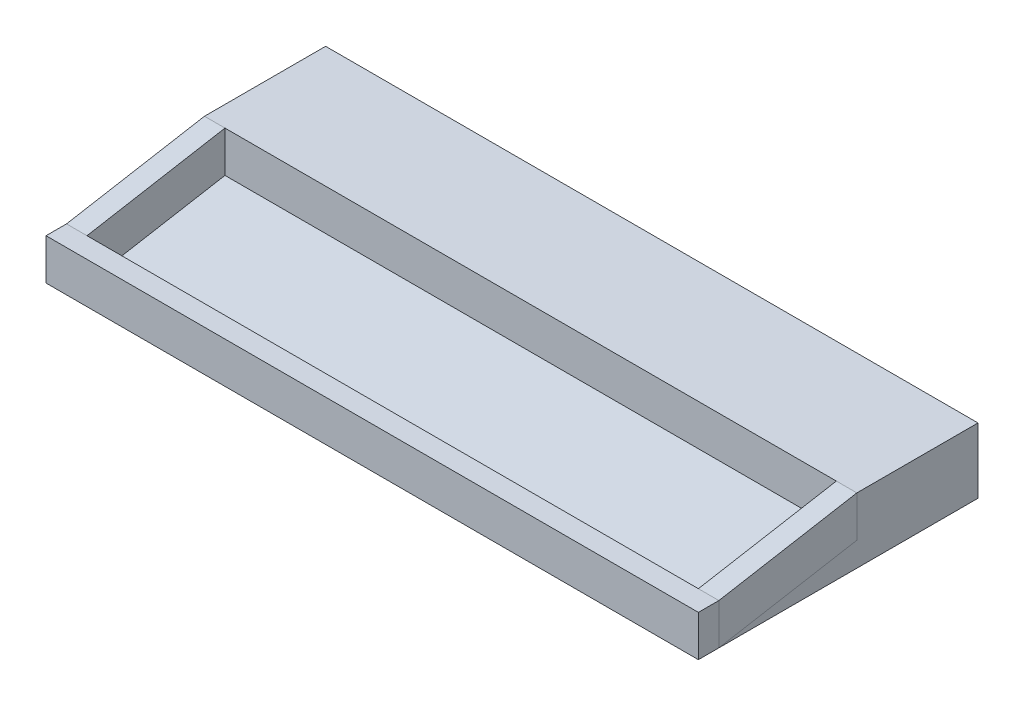
ISO-10303-21;
HEADER;
FILE_DESCRIPTION(('STEP AP214'),'2;1');
FILE_NAME('part.step','',(''),(''),'','','');
FILE_SCHEMA(('AUTOMOTIVE_DESIGN { 1 0 10303 214 1 1 1 1 }'));
ENDSEC;
DATA;
#1=APPLICATION_CONTEXT('core data for automotive mechanical design processes');
#2=APPLICATION_PROTOCOL_DEFINITION('international standard','automotive_design',2000,#1);
#3=PRODUCT_CONTEXT('',#1,'mechanical');
#4=PRODUCT('Part','Part','',(#3));
#5=PRODUCT_RELATED_PRODUCT_CATEGORY('part','',(#4));
#6=PRODUCT_DEFINITION_FORMATION('','',#4);
#7=PRODUCT_DEFINITION_CONTEXT('part definition',#1,'design');
#8=PRODUCT_DEFINITION('design','',#6,#7);
#9=PRODUCT_DEFINITION_SHAPE('','',#8);
#10=(LENGTH_UNIT() NAMED_UNIT(*) SI_UNIT(.MILLI.,.METRE.));
#11=(NAMED_UNIT(*) PLANE_ANGLE_UNIT() SI_UNIT($,.RADIAN.));
#12=(NAMED_UNIT(*) SI_UNIT($,.STERADIAN.) SOLID_ANGLE_UNIT());
#13=UNCERTAINTY_MEASURE_WITH_UNIT(LENGTH_MEASURE(1.E-05),#10,'distance_accuracy_value','');
#14=(GEOMETRIC_REPRESENTATION_CONTEXT(3) GLOBAL_UNCERTAINTY_ASSIGNED_CONTEXT((#13)) GLOBAL_UNIT_ASSIGNED_CONTEXT((#10,
#11,#12)) REPRESENTATION_CONTEXT('',''));
#15=CARTESIAN_POINT('',(0.,0.,0.));
#16=DIRECTION('',(0.,0.,1.));
#17=DIRECTION('',(1.,0.,0.));
#18=AXIS2_PLACEMENT_3D('',#15,#16,#17);
#19=CARTESIAN_POINT('',(22.,-18.5466378588945,57.9784896892125));
#20=DIRECTION('',(0.,0.,-1.));
#21=DIRECTION('',(-1.,0.,0.));
#22=AXIS2_PLACEMENT_3D('',#19,#20,#21);
#23=PLANE('',#22);
#24=DIRECTION('',(0.,-1.,0.));
#25=VECTOR('',#24,1.);
#26=CARTESIAN_POINT('',(0.,-18.5466378588945,57.9784896892125));
#27=LINE('',#26,#25);
#28=CARTESIAN_POINT('',(0.,25.4533621411055,57.9784896892125));
#29=VERTEX_POINT('',#28);
#30=CARTESIAN_POINT('',(0.,-18.5466378588945,57.9784896892125));
#31=VERTEX_POINT('',#30);
#32=EDGE_CURVE('E111',#29,#31,#27,.T.);
#33=ORIENTED_EDGE('',*,*,#32,.F.);
#34=DIRECTION('',(-1.,0.,0.));
#35=VECTOR('',#34,1.);
#36=CARTESIAN_POINT('',(22.,25.4533621411055,57.9784896892125));
#37=LINE('',#36,#35);
#38=CARTESIAN_POINT('',(22.,25.4533621411055,57.9784896892125));
#39=VERTEX_POINT('',#38);
#40=EDGE_CURVE('E12',#39,#29,#37,.T.);
#41=ORIENTED_EDGE('',*,*,#40,.F.);
#42=DIRECTION('',(0.,-1.,0.));
#43=VECTOR('',#42,1.);
#44=CARTESIAN_POINT('',(22.,-18.5466378588945,57.9784896892125));
#45=LINE('',#44,#43);
#46=CARTESIAN_POINT('',(22.,-18.5466378588945,57.9784896892125));
#47=VERTEX_POINT('',#46);
#48=EDGE_CURVE('E105',#39,#47,#45,.T.);
#49=ORIENTED_EDGE('',*,*,#48,.T.);
#50=DIRECTION('',(-1.,0.,0.));
#51=VECTOR('',#50,1.);
#52=CARTESIAN_POINT('',(22.,-18.5466378588945,57.9784896892125));
#53=LINE('',#52,#51);
#54=EDGE_CURVE('E50',#47,#31,#53,.T.);
#55=ORIENTED_EDGE('',*,*,#54,.T.);
#56=EDGE_LOOP('',(#33,#41,#49,#55));
#57=FACE_BOUND('',#56,.T.);
#58=ADVANCED_FACE('F47',(#57),#23,.T.);
#59=CARTESIAN_POINT('',(22.,25.4533621411055,57.9784896892125));
#60=DIRECTION('',(0.,0.984924044664879,0.172987358616101));
#61=DIRECTION('',(0.,-0.172987358616101,0.984924044664879));
#62=AXIS2_PLACEMENT_3D('',#59,#60,#61);
#63=PLANE('',#62);
#64=DIRECTION('',(0.,0.172987358616101,-0.984924044664879));
#65=VECTOR('',#64,1.);
#66=CARTESIAN_POINT('',(0.,25.4533621411055,57.9784896892125));
#67=LINE('',#66,#65);
#68=CARTESIAN_POINT('',(0.,-0.546637858894552,206.012573602344));
#69=VERTEX_POINT('',#68);
#70=EDGE_CURVE('E107',#69,#29,#67,.T.);
#71=ORIENTED_EDGE('',*,*,#70,.F.);
#72=DIRECTION('',(-1.,0.,0.));
#73=VECTOR('',#72,1.);
#74=CARTESIAN_POINT('',(22.,-0.546637858894552,206.012573602344));
#75=LINE('',#74,#73);
#76=CARTESIAN_POINT('',(22.,-0.546637858894552,206.012573602344));
#77=VERTEX_POINT('',#76);
#78=EDGE_CURVE('E56',#77,#69,#75,.T.);
#79=ORIENTED_EDGE('',*,*,#78,.F.);
#80=DIRECTION('',(0.,0.172987358616101,-0.984924044664879));
#81=VECTOR('',#80,1.);
#82=CARTESIAN_POINT('',(22.,25.4533621411055,57.9784896892125));
#83=LINE('',#82,#81);
#84=EDGE_CURVE('E102',#77,#39,#83,.T.);
#85=ORIENTED_EDGE('',*,*,#84,.T.);
#86=ORIENTED_EDGE('',*,*,#40,.T.);
#87=EDGE_LOOP('',(#71,#79,#85,#86));
#88=FACE_BOUND('',#87,.T.);
#89=ADVANCED_FACE('F121',(#88),#63,.T.);
#90=CARTESIAN_POINT('',(22.,-0.546637858894552,206.012573602344));
#91=DIRECTION('',(0.,0.,1.));
#92=DIRECTION('',(0.,-1.,0.));
#93=AXIS2_PLACEMENT_3D('',#90,#91,#92);
#94=PLANE('',#93);
#95=DIRECTION('',(0.,1.,0.));
#96=VECTOR('',#95,1.);
#97=CARTESIAN_POINT('',(0.,-0.546637858894552,206.012573602344));
#98=LINE('',#97,#96);
#99=CARTESIAN_POINT('',(0.,-44.5466378588946,206.012573602344));
#100=VERTEX_POINT('',#99);
#101=EDGE_CURVE('E97',#100,#69,#98,.T.);
#102=ORIENTED_EDGE('',*,*,#101,.F.);
#103=DIRECTION('',(-1.,0.,0.));
#104=VECTOR('',#103,1.);
#105=CARTESIAN_POINT('',(22.,-44.5466378588946,206.012573602344));
#106=LINE('',#105,#104);
#107=CARTESIAN_POINT('',(22.,-44.5466378588946,206.012573602344));
#108=VERTEX_POINT('',#107);
#109=EDGE_CURVE('E92',#108,#100,#106,.T.);
#110=ORIENTED_EDGE('',*,*,#109,.F.);
#111=DIRECTION('',(0.,1.,0.));
#112=VECTOR('',#111,1.);
#113=CARTESIAN_POINT('',(22.,-0.546637858894552,206.012573602344));
#114=LINE('',#113,#112);
#115=EDGE_CURVE('E95',#108,#77,#114,.T.);
#116=ORIENTED_EDGE('',*,*,#115,.T.);
#117=ORIENTED_EDGE('',*,*,#78,.T.);
#118=EDGE_LOOP('',(#102,#110,#116,#117));
#119=FACE_BOUND('',#118,.T.);
#120=ADVANCED_FACE('F94',(#119),#94,.T.);
#121=CARTESIAN_POINT('',(22.,-44.5466378588946,206.012573602344));
#122=DIRECTION('',(0.,-0.984924044664879,-0.172987358616101));
#123=DIRECTION('',(0.,0.172987358616101,-0.984924044664879));
#124=AXIS2_PLACEMENT_3D('',#121,#122,#123);
#125=PLANE('',#124);
#126=DIRECTION('',(0.,-0.172987358616101,0.984924044664879));
#127=VECTOR('',#126,1.);
#128=CARTESIAN_POINT('',(0.,-44.5466378588946,206.012573602344));
#129=LINE('',#128,#127);
#130=EDGE_CURVE('E114',#31,#100,#129,.T.);
#131=ORIENTED_EDGE('',*,*,#130,.F.);
#132=ORIENTED_EDGE('',*,*,#54,.F.);
#133=DIRECTION('',(0.,-0.172987358616101,0.984924044664879));
#134=VECTOR('',#133,1.);
#135=CARTESIAN_POINT('',(22.,-44.5466378588946,206.012573602344));
#136=LINE('',#135,#134);
#137=EDGE_CURVE('E101',#47,#108,#136,.T.);
#138=ORIENTED_EDGE('',*,*,#137,.T.);
#139=ORIENTED_EDGE('',*,*,#109,.T.);
#140=EDGE_LOOP('',(#131,#132,#138,#139));
#141=FACE_BOUND('',#140,.T.);
#142=ADVANCED_FACE('F104',(#141),#125,.T.);
#143=CARTESIAN_POINT('',(22.,0.,0.));
#144=DIRECTION('',(1.,0.,0.));
#145=DIRECTION('',(0.,0.,-1.));
#146=AXIS2_PLACEMENT_3D('',#143,#144,#145);
#147=PLANE('',#146);
#148=ORIENTED_EDGE('',*,*,#48,.F.);
#149=ORIENTED_EDGE('',*,*,#84,.F.);
#150=ORIENTED_EDGE('',*,*,#115,.F.);
#151=ORIENTED_EDGE('',*,*,#137,.F.);
#152=EDGE_LOOP('',(#148,#149,#150,#151));
#153=FACE_BOUND('',#152,.T.);
#154=ADVANCED_FACE('F100',(#153),#147,.T.);
#155=CARTESIAN_POINT('',(0.,0.,0.));
#156=DIRECTION('',(1.,0.,0.));
#157=DIRECTION('',(0.,0.,-1.));
#158=AXIS2_PLACEMENT_3D('',#155,#156,#157);
#159=PLANE('',#158);
#160=ORIENTED_EDGE('',*,*,#32,.T.);
#161=ORIENTED_EDGE('',*,*,#130,.T.);
#162=ORIENTED_EDGE('',*,*,#101,.T.);
#163=ORIENTED_EDGE('',*,*,#70,.T.);
#164=EDGE_LOOP('',(#160,#161,#162,#163));
#165=FACE_BOUND('',#164,.T.);
#166=ADVANCED_FACE('F120',(#165),#159,.F.);
#167=CLOSED_SHELL('',(#58,#89,#120,#142,#154,#166));
#168=MANIFOLD_SOLID_BREP('B2',#167);
#169=CARTESIAN_POINT('',(678.,-18.5466378588945,57.9784896892125));
#170=DIRECTION('',(0.,0.,-1.));
#171=DIRECTION('',(-1.,0.,0.));
#172=AXIS2_PLACEMENT_3D('',#169,#170,#171);
#173=PLANE('',#172);
#174=DIRECTION('',(0.,1.,0.));
#175=VECTOR('',#174,1.);
#176=CARTESIAN_POINT('',(700.,-18.5466378588945,57.9784896892125));
#177=LINE('',#176,#175);
#178=CARTESIAN_POINT('',(700.,-18.5466378588945,57.9784896892125));
#179=VERTEX_POINT('',#178);
#180=CARTESIAN_POINT('',(700.,25.4533621411055,57.9784896892125));
#181=VERTEX_POINT('',#180);
#182=EDGE_CURVE('E250',#179,#181,#177,.T.);
#183=ORIENTED_EDGE('',*,*,#182,.F.);
#184=DIRECTION('',(1.,0.,0.));
#185=VECTOR('',#184,1.);
#186=CARTESIAN_POINT('',(678.,-18.5466378588945,57.9784896892125));
#187=LINE('',#186,#185);
#188=CARTESIAN_POINT('',(678.,-18.5466378588945,57.9784896892125));
#189=VERTEX_POINT('',#188);
#190=EDGE_CURVE('E45',#189,#179,#187,.T.);
#191=ORIENTED_EDGE('',*,*,#190,.F.);
#192=DIRECTION('',(0.,1.,0.));
#193=VECTOR('',#192,1.);
#194=CARTESIAN_POINT('',(678.,-18.5466378588945,57.9784896892125));
#195=LINE('',#194,#193);
#196=CARTESIAN_POINT('',(678.,25.4533621411055,57.9784896892125));
#197=VERTEX_POINT('',#196);
#198=EDGE_CURVE('E244',#189,#197,#195,.T.);
#199=ORIENTED_EDGE('',*,*,#198,.T.);
#200=DIRECTION('',(1.,0.,0.));
#201=VECTOR('',#200,1.);
#202=CARTESIAN_POINT('',(678.,25.4533621411055,57.9784896892125));
#203=LINE('',#202,#201);
#204=EDGE_CURVE('E189',#197,#181,#203,.T.);
#205=ORIENTED_EDGE('',*,*,#204,.T.);
#206=EDGE_LOOP('',(#183,#191,#199,#205));
#207=FACE_BOUND('',#206,.T.);
#208=ADVANCED_FACE('F186',(#207),#173,.T.);
#209=CARTESIAN_POINT('',(678.,-44.5466378588946,206.012573602344));
#210=DIRECTION('',(0.,-0.984924044664879,-0.172987358616101));
#211=DIRECTION('',(0.,0.172987358616101,-0.984924044664879));
#212=AXIS2_PLACEMENT_3D('',#209,#210,#211);
#213=PLANE('',#212);
#214=DIRECTION('',(0.,0.172987358616101,-0.984924044664879));
#215=VECTOR('',#214,1.);
#216=CARTESIAN_POINT('',(700.,-44.5466378588946,206.012573602344));
#217=LINE('',#216,#215);
#218=CARTESIAN_POINT('',(700.,-44.5466378588946,206.012573602344));
#219=VERTEX_POINT('',#218);
#220=EDGE_CURVE('E246',#219,#179,#217,.T.);
#221=ORIENTED_EDGE('',*,*,#220,.F.);
#222=DIRECTION('',(1.,0.,0.));
#223=VECTOR('',#222,1.);
#224=CARTESIAN_POINT('',(678.,-44.5466378588946,206.012573602344));
#225=LINE('',#224,#223);
#226=CARTESIAN_POINT('',(678.,-44.5466378588946,206.012573602344));
#227=VERTEX_POINT('',#226);
#228=EDGE_CURVE('E195',#227,#219,#225,.T.);
#229=ORIENTED_EDGE('',*,*,#228,.F.);
#230=DIRECTION('',(0.,0.172987358616101,-0.984924044664879));
#231=VECTOR('',#230,1.);
#232=CARTESIAN_POINT('',(678.,-44.5466378588946,206.012573602344));
#233=LINE('',#232,#231);
#234=EDGE_CURVE('E241',#227,#189,#233,.T.);
#235=ORIENTED_EDGE('',*,*,#234,.T.);
#236=ORIENTED_EDGE('',*,*,#190,.T.);
#237=EDGE_LOOP('',(#221,#229,#235,#236));
#238=FACE_BOUND('',#237,.T.);
#239=ADVANCED_FACE('F260',(#238),#213,.T.);
#240=CARTESIAN_POINT('',(678.,-0.546637858894552,206.012573602344));
#241=DIRECTION('',(0.,0.,1.));
#242=DIRECTION('',(0.,-1.,0.));
#243=AXIS2_PLACEMENT_3D('',#240,#241,#242);
#244=PLANE('',#243);
#245=DIRECTION('',(0.,-1.,0.));
#246=VECTOR('',#245,1.);
#247=CARTESIAN_POINT('',(700.,-0.546637858894552,206.012573602344));
#248=LINE('',#247,#246);
#249=CARTESIAN_POINT('',(700.,-0.546637858894552,206.012573602344));
#250=VERTEX_POINT('',#249);
#251=EDGE_CURVE('E236',#250,#219,#248,.T.);
#252=ORIENTED_EDGE('',*,*,#251,.F.);
#253=DIRECTION('',(1.,0.,0.));
#254=VECTOR('',#253,1.);
#255=CARTESIAN_POINT('',(678.,-0.546637858894552,206.012573602344));
#256=LINE('',#255,#254);
#257=CARTESIAN_POINT('',(678.,-0.546637858894552,206.012573602344));
#258=VERTEX_POINT('',#257);
#259=EDGE_CURVE('E231',#258,#250,#256,.T.);
#260=ORIENTED_EDGE('',*,*,#259,.F.);
#261=DIRECTION('',(0.,-1.,0.));
#262=VECTOR('',#261,1.);
#263=CARTESIAN_POINT('',(678.,-0.546637858894552,206.012573602344));
#264=LINE('',#263,#262);
#265=EDGE_CURVE('E234',#258,#227,#264,.T.);
#266=ORIENTED_EDGE('',*,*,#265,.T.);
#267=ORIENTED_EDGE('',*,*,#228,.T.);
#268=EDGE_LOOP('',(#252,#260,#266,#267));
#269=FACE_BOUND('',#268,.T.);
#270=ADVANCED_FACE('F233',(#269),#244,.T.);
#271=CARTESIAN_POINT('',(678.,25.4533621411055,57.9784896892125));
#272=DIRECTION('',(0.,0.984924044664879,0.172987358616101));
#273=DIRECTION('',(0.,-0.172987358616101,0.984924044664879));
#274=AXIS2_PLACEMENT_3D('',#271,#272,#273);
#275=PLANE('',#274);
#276=DIRECTION('',(0.,-0.172987358616101,0.984924044664879));
#277=VECTOR('',#276,1.);
#278=CARTESIAN_POINT('',(700.,25.4533621411055,57.9784896892125));
#279=LINE('',#278,#277);
#280=EDGE_CURVE('E253',#181,#250,#279,.T.);
#281=ORIENTED_EDGE('',*,*,#280,.F.);
#282=ORIENTED_EDGE('',*,*,#204,.F.);
#283=DIRECTION('',(0.,-0.172987358616101,0.984924044664879));
#284=VECTOR('',#283,1.);
#285=CARTESIAN_POINT('',(678.,25.4533621411055,57.9784896892125));
#286=LINE('',#285,#284);
#287=EDGE_CURVE('E240',#197,#258,#286,.T.);
#288=ORIENTED_EDGE('',*,*,#287,.T.);
#289=ORIENTED_EDGE('',*,*,#259,.T.);
#290=EDGE_LOOP('',(#281,#282,#288,#289));
#291=FACE_BOUND('',#290,.T.);
#292=ADVANCED_FACE('F243',(#291),#275,.T.);
#293=CARTESIAN_POINT('',(678.,0.,0.));
#294=DIRECTION('',(1.,0.,0.));
#295=DIRECTION('',(0.,0.,-1.));
#296=AXIS2_PLACEMENT_3D('',#293,#294,#295);
#297=PLANE('',#296);
#298=ORIENTED_EDGE('',*,*,#198,.F.);
#299=ORIENTED_EDGE('',*,*,#234,.F.);
#300=ORIENTED_EDGE('',*,*,#265,.F.);
#301=ORIENTED_EDGE('',*,*,#287,.F.);
#302=EDGE_LOOP('',(#298,#299,#300,#301));
#303=FACE_BOUND('',#302,.T.);
#304=ADVANCED_FACE('F239',(#303),#297,.F.);
#305=CARTESIAN_POINT('',(700.,0.,0.));
#306=DIRECTION('',(1.,0.,0.));
#307=DIRECTION('',(0.,0.,-1.));
#308=AXIS2_PLACEMENT_3D('',#305,#306,#307);
#309=PLANE('',#308);
#310=ORIENTED_EDGE('',*,*,#182,.T.);
#311=ORIENTED_EDGE('',*,*,#280,.T.);
#312=ORIENTED_EDGE('',*,*,#251,.T.);
#313=ORIENTED_EDGE('',*,*,#220,.T.);
#314=EDGE_LOOP('',(#310,#311,#312,#313));
#315=FACE_BOUND('',#314,.T.);
#316=ADVANCED_FACE('F259',(#315),#309,.T.);
#317=CLOSED_SHELL('',(#208,#239,#270,#292,#304,#316));
#318=MANIFOLD_SOLID_BREP('B6',#317);
#319=CARTESIAN_POINT('',(700.,0.,228.012573602344));
#320=DIRECTION('',(0.,0.,1.));
#321=DIRECTION('',(1.,0.,0.));
#322=AXIS2_PLACEMENT_3D('',#319,#320,#321);
#323=PLANE('',#322);
#324=DIRECTION('',(0.,1.,0.));
#325=VECTOR('',#324,1.);
#326=CARTESIAN_POINT('',(0.,0.,228.012573602344));
#327=LINE('',#326,#325);
#328=CARTESIAN_POINT('',(0.,-44.5466378588946,228.012573602344));
#329=VERTEX_POINT('',#328);
#330=CARTESIAN_POINT('',(0.,-0.546637858894556,228.012573602344));
#331=VERTEX_POINT('',#330);
#332=EDGE_CURVE('E387',#329,#331,#327,.T.);
#333=ORIENTED_EDGE('',*,*,#332,.F.);
#334=DIRECTION('',(-1.,0.,0.));
#335=VECTOR('',#334,1.);
#336=CARTESIAN_POINT('',(700.,-44.5466378588946,228.012573602344));
#337=LINE('',#336,#335);
#338=CARTESIAN_POINT('',(700.,-44.5466378588946,228.012573602344));
#339=VERTEX_POINT('',#338);
#340=EDGE_CURVE('E184',#339,#329,#337,.T.);
#341=ORIENTED_EDGE('',*,*,#340,.F.);
#342=DIRECTION('',(0.,1.,0.));
#343=VECTOR('',#342,1.);
#344=CARTESIAN_POINT('',(700.,0.,228.012573602344));
#345=LINE('',#344,#343);
#346=CARTESIAN_POINT('',(700.,-0.546637858894556,228.012573602344));
#347=VERTEX_POINT('',#346);
#348=EDGE_CURVE('E381',#339,#347,#345,.T.);
#349=ORIENTED_EDGE('',*,*,#348,.T.);
#350=DIRECTION('',(-1.,0.,0.));
#351=VECTOR('',#350,1.);
#352=CARTESIAN_POINT('',(700.,-0.546637858894556,228.012573602344));
#353=LINE('',#352,#351);
#354=EDGE_CURVE('E362',#347,#331,#353,.T.);
#355=ORIENTED_EDGE('',*,*,#354,.T.);
#356=EDGE_LOOP('',(#333,#341,#349,#355));
#357=FACE_BOUND('',#356,.T.);
#358=ADVANCED_FACE('F324',(#357),#323,.T.);
#359=CARTESIAN_POINT('',(700.,-44.5466378588945,0.));
#360=DIRECTION('',(0.,-1.,0.));
#361=DIRECTION('',(0.,0.,-1.));
#362=AXIS2_PLACEMENT_3D('',#359,#360,#361);
#363=PLANE('',#362);
#364=DIRECTION('',(0.,0.,1.));
#365=VECTOR('',#364,1.);
#366=CARTESIAN_POINT('',(0.,-44.5466378588945,0.));
#367=LINE('',#366,#365);
#368=CARTESIAN_POINT('',(0.,-44.5466378588946,206.012573602344));
#369=VERTEX_POINT('',#368);
#370=EDGE_CURVE('E375',#369,#329,#367,.T.);
#371=ORIENTED_EDGE('',*,*,#370,.F.);
#372=DIRECTION('',(-1.,0.,0.));
#373=VECTOR('',#372,1.);
#374=CARTESIAN_POINT('',(700.,-44.5466378588946,206.012573602344));
#375=LINE('',#374,#373);
#376=CARTESIAN_POINT('',(700.,-44.5466378588946,206.012573602344));
#377=VERTEX_POINT('',#376);
#378=EDGE_CURVE('E332',#377,#369,#375,.T.);
#379=ORIENTED_EDGE('',*,*,#378,.F.);
#380=DIRECTION('',(0.,0.,1.));
#381=VECTOR('',#380,1.);
#382=CARTESIAN_POINT('',(700.,-44.5466378588945,0.));
#383=LINE('',#382,#381);
#384=EDGE_CURVE('E373',#377,#339,#383,.T.);
#385=ORIENTED_EDGE('',*,*,#384,.T.);
#386=ORIENTED_EDGE('',*,*,#340,.T.);
#387=EDGE_LOOP('',(#371,#379,#385,#386));
#388=FACE_BOUND('',#387,.T.);
#389=ADVANCED_FACE('F371',(#388),#363,.T.);
#390=CARTESIAN_POINT('',(700.,0.,206.012573602344));
#391=DIRECTION('',(0.,0.,1.));
#392=DIRECTION('',(1.,0.,0.));
#393=AXIS2_PLACEMENT_3D('',#390,#391,#392);
#394=PLANE('',#393);
#395=DIRECTION('',(0.,1.,0.));
#396=VECTOR('',#395,1.);
#397=CARTESIAN_POINT('',(0.,0.,206.012573602344));
#398=LINE('',#397,#396);
#399=CARTESIAN_POINT('',(0.,-0.546637858894552,206.012573602344));
#400=VERTEX_POINT('',#399);
#401=EDGE_CURVE('E355',#369,#400,#398,.T.);
#402=ORIENTED_EDGE('',*,*,#401,.T.);
#403=DIRECTION('',(-1.,0.,0.));
#404=VECTOR('',#403,1.);
#405=CARTESIAN_POINT('',(700.,-0.546637858894552,206.012573602344));
#406=LINE('',#405,#404);
#407=CARTESIAN_POINT('',(700.,-0.546637858894552,206.012573602344));
#408=VERTEX_POINT('',#407);
#409=EDGE_CURVE('E376',#408,#400,#406,.T.);
#410=ORIENTED_EDGE('',*,*,#409,.F.);
#411=DIRECTION('',(0.,1.,0.));
#412=VECTOR('',#411,1.);
#413=CARTESIAN_POINT('',(700.,0.,206.012573602344));
#414=LINE('',#413,#412);
#415=EDGE_CURVE('E377',#377,#408,#414,.T.);
#416=ORIENTED_EDGE('',*,*,#415,.F.);
#417=ORIENTED_EDGE('',*,*,#378,.T.);
#418=EDGE_LOOP('',(#402,#410,#416,#417));
#419=FACE_BOUND('',#418,.T.);
#420=ADVANCED_FACE('F378',(#419),#394,.F.);
#421=CARTESIAN_POINT('',(700.,-0.546637858894513,0.));
#422=DIRECTION('',(0.,-1.,0.));
#423=DIRECTION('',(0.,0.,-1.));
#424=AXIS2_PLACEMENT_3D('',#421,#422,#423);
#425=PLANE('',#424);
#426=DIRECTION('',(0.,0.,1.));
#427=VECTOR('',#426,1.);
#428=CARTESIAN_POINT('',(0.,-0.546637858894513,0.));
#429=LINE('',#428,#427);
#430=EDGE_CURVE('E383',#400,#331,#429,.T.);
#431=ORIENTED_EDGE('',*,*,#430,.T.);
#432=ORIENTED_EDGE('',*,*,#354,.F.);
#433=DIRECTION('',(0.,0.,1.));
#434=VECTOR('',#433,1.);
#435=CARTESIAN_POINT('',(700.,-0.546637858894513,0.));
#436=LINE('',#435,#434);
#437=EDGE_CURVE('E340',#408,#347,#436,.T.);
#438=ORIENTED_EDGE('',*,*,#437,.F.);
#439=ORIENTED_EDGE('',*,*,#409,.T.);
#440=EDGE_LOOP('',(#431,#432,#438,#439));
#441=FACE_BOUND('',#440,.T.);
#442=ADVANCED_FACE('F396',(#441),#425,.F.);
#443=CARTESIAN_POINT('',(700.,0.,0.));
#444=DIRECTION('',(1.,0.,0.));
#445=DIRECTION('',(0.,0.,-1.));
#446=AXIS2_PLACEMENT_3D('',#443,#444,#445);
#447=PLANE('',#446);
#448=ORIENTED_EDGE('',*,*,#348,.F.);
#449=ORIENTED_EDGE('',*,*,#384,.F.);
#450=ORIENTED_EDGE('',*,*,#415,.T.);
#451=ORIENTED_EDGE('',*,*,#437,.T.);
#452=EDGE_LOOP('',(#448,#449,#450,#451));
#453=FACE_BOUND('',#452,.T.);
#454=ADVANCED_FACE('F380',(#453),#447,.T.);
#455=CARTESIAN_POINT('',(0.,0.,0.));
#456=DIRECTION('',(1.,0.,0.));
#457=DIRECTION('',(0.,0.,-1.));
#458=AXIS2_PLACEMENT_3D('',#455,#456,#457);
#459=PLANE('',#458);
#460=ORIENTED_EDGE('',*,*,#332,.T.);
#461=ORIENTED_EDGE('',*,*,#430,.F.);
#462=ORIENTED_EDGE('',*,*,#401,.F.);
#463=ORIENTED_EDGE('',*,*,#370,.T.);
#464=EDGE_LOOP('',(#460,#461,#462,#463));
#465=FACE_BOUND('',#464,.T.);
#466=ADVANCED_FACE('F398',(#465),#459,.F.);
#467=CLOSED_SHELL('',(#358,#389,#420,#442,#454,#466));
#468=MANIFOLD_SOLID_BREP('B39',#467);
#469=CARTESIAN_POINT('',(700.,0.,57.9784896892125));
#470=DIRECTION('',(0.,0.,-1.));
#471=DIRECTION('',(-1.,0.,0.));
#472=AXIS2_PLACEMENT_3D('',#469,#470,#471);
#473=PLANE('',#472);
#474=DIRECTION('',(0.,-1.,0.));
#475=VECTOR('',#474,1.);
#476=CARTESIAN_POINT('',(0.,0.,57.9784896892125));
#477=LINE('',#476,#475);
#478=CARTESIAN_POINT('',(0.,25.4533621411055,57.9784896892125));
#479=VERTEX_POINT('',#478);
#480=CARTESIAN_POINT('',(0.,-18.5466378588945,57.9784896892125));
#481=VERTEX_POINT('',#480);
#482=EDGE_CURVE('E543',#479,#481,#477,.T.);
#483=ORIENTED_EDGE('',*,*,#482,.T.);
#484=DIRECTION('',(-1.,0.,0.));
#485=VECTOR('',#484,1.);
#486=CARTESIAN_POINT('',(700.,-18.5466378588945,57.9784896892125));
#487=LINE('',#486,#485);
#488=CARTESIAN_POINT('',(700.,-18.5466378588945,57.9784896892125));
#489=VERTEX_POINT('',#488);
#490=EDGE_CURVE('E322',#489,#481,#487,.T.);
#491=ORIENTED_EDGE('',*,*,#490,.F.);
#492=DIRECTION('',(0.,-1.,0.));
#493=VECTOR('',#492,1.);
#494=CARTESIAN_POINT('',(700.,0.,57.9784896892125));
#495=LINE('',#494,#493);
#496=CARTESIAN_POINT('',(700.,25.4533621411055,57.9784896892125));
#497=VERTEX_POINT('',#496);
#498=EDGE_CURVE('E553',#497,#489,#495,.T.);
#499=ORIENTED_EDGE('',*,*,#498,.F.);
#500=DIRECTION('',(-1.,0.,0.));
#501=VECTOR('',#500,1.);
#502=CARTESIAN_POINT('',(700.,25.4533621411055,57.9784896892125));
#503=LINE('',#502,#501);
#504=EDGE_CURVE('E539',#497,#479,#503,.T.);
#505=ORIENTED_EDGE('',*,*,#504,.T.);
#506=EDGE_LOOP('',(#483,#491,#499,#505));
#507=FACE_BOUND('',#506,.T.);
#508=ADVANCED_FACE('F471',(#507),#473,.F.);
#509=CARTESIAN_POINT('',(700.,-8.11329584938239,-1.42498056196118));
#510=DIRECTION('',(0.,-0.984924044664879,-0.172987358616101));
#511=DIRECTION('',(0.,0.172987358616101,-0.984924044664879));
#512=AXIS2_PLACEMENT_3D('',#509,#510,#511);
#513=PLANE('',#512);
#514=DIRECTION('',(0.,-0.172987358616101,0.984924044664879));
#515=VECTOR('',#514,1.);
#516=CARTESIAN_POINT('',(0.,-8.11329584938239,-1.42498056196118));
#517=LINE('',#516,#515);
#518=CARTESIAN_POINT('',(0.,-44.5466378588946,206.012573602344));
#519=VERTEX_POINT('',#518);
#520=EDGE_CURVE('E546',#481,#519,#517,.T.);
#521=ORIENTED_EDGE('',*,*,#520,.T.);
#522=DIRECTION('',(-1.,0.,0.));
#523=VECTOR('',#522,1.);
#524=CARTESIAN_POINT('',(700.,-44.5466378588946,206.012573602344));
#525=LINE('',#524,#523);
#526=CARTESIAN_POINT('',(700.,-44.5466378588946,206.012573602344));
#527=VERTEX_POINT('',#526);
#528=EDGE_CURVE('E479',#527,#519,#525,.T.);
#529=ORIENTED_EDGE('',*,*,#528,.F.);
#530=DIRECTION('',(0.,-0.172987358616101,0.984924044664879));
#531=VECTOR('',#530,1.);
#532=CARTESIAN_POINT('',(700.,-8.11329584938239,-1.42498056196118));
#533=LINE('',#532,#531);
#534=EDGE_CURVE('E517',#489,#527,#533,.T.);
#535=ORIENTED_EDGE('',*,*,#534,.F.);
#536=ORIENTED_EDGE('',*,*,#490,.T.);
#537=EDGE_LOOP('',(#521,#529,#535,#536));
#538=FACE_BOUND('',#537,.T.);
#539=ADVANCED_FACE('F555',(#538),#513,.F.);
#540=CARTESIAN_POINT('',(700.,-44.5466378588945,0.));
#541=DIRECTION('',(0.,-1.,0.));
#542=DIRECTION('',(0.,0.,-1.));
#543=AXIS2_PLACEMENT_3D('',#540,#541,#542);
#544=PLANE('',#543);
#545=DIRECTION('',(0.,0.,1.));
#546=VECTOR('',#545,1.);
#547=CARTESIAN_POINT('',(0.,-44.5466378588945,0.));
#548=LINE('',#547,#546);
#549=CARTESIAN_POINT('',(0.,-44.5466378588945,-72.0215103107875));
#550=VERTEX_POINT('',#549);
#551=EDGE_CURVE('E528',#550,#519,#548,.T.);
#552=ORIENTED_EDGE('',*,*,#551,.F.);
#553=DIRECTION('',(-1.,0.,0.));
#554=VECTOR('',#553,1.);
#555=CARTESIAN_POINT('',(700.,-44.5466378588945,-72.0215103107875));
#556=LINE('',#555,#554);
#557=CARTESIAN_POINT('',(700.,-44.5466378588945,-72.0215103107875));
#558=VERTEX_POINT('',#557);
#559=EDGE_CURVE('E523',#558,#550,#556,.T.);
#560=ORIENTED_EDGE('',*,*,#559,.F.);
#561=DIRECTION('',(0.,0.,1.));
#562=VECTOR('',#561,1.);
#563=CARTESIAN_POINT('',(700.,-44.5466378588945,0.));
#564=LINE('',#563,#562);
#565=EDGE_CURVE('E526',#558,#527,#564,.T.);
#566=ORIENTED_EDGE('',*,*,#565,.T.);
#567=ORIENTED_EDGE('',*,*,#528,.T.);
#568=EDGE_LOOP('',(#552,#560,#566,#567));
#569=FACE_BOUND('',#568,.T.);
#570=ADVANCED_FACE('F525',(#569),#544,.T.);
#571=CARTESIAN_POINT('',(700.,0.,-72.0215103107875));
#572=DIRECTION('',(0.,0.,-1.));
#573=DIRECTION('',(-1.,0.,0.));
#574=AXIS2_PLACEMENT_3D('',#571,#572,#573);
#575=PLANE('',#574);
#576=DIRECTION('',(0.,-1.,0.));
#577=VECTOR('',#576,1.);
#578=CARTESIAN_POINT('',(0.,0.,-72.0215103107875));
#579=LINE('',#578,#577);
#580=CARTESIAN_POINT('',(0.,25.4533621411055,-72.0215103107875));
#581=VERTEX_POINT('',#580);
#582=EDGE_CURVE('E550',#581,#550,#579,.T.);
#583=ORIENTED_EDGE('',*,*,#582,.F.);
#584=DIRECTION('',(-1.,0.,0.));
#585=VECTOR('',#584,1.);
#586=CARTESIAN_POINT('',(700.,25.4533621411055,-72.0215103107875));
#587=LINE('',#586,#585);
#588=CARTESIAN_POINT('',(700.,25.4533621411055,-72.0215103107875));
#589=VERTEX_POINT('',#588);
#590=EDGE_CURVE('E506',#589,#581,#587,.T.);
#591=ORIENTED_EDGE('',*,*,#590,.F.);
#592=DIRECTION('',(0.,-1.,0.));
#593=VECTOR('',#592,1.);
#594=CARTESIAN_POINT('',(700.,0.,-72.0215103107875));
#595=LINE('',#594,#593);
#596=EDGE_CURVE('E535',#589,#558,#595,.T.);
#597=ORIENTED_EDGE('',*,*,#596,.T.);
#598=ORIENTED_EDGE('',*,*,#559,.T.);
#599=EDGE_LOOP('',(#583,#591,#597,#598));
#600=FACE_BOUND('',#599,.T.);
#601=ADVANCED_FACE('F537',(#600),#575,.T.);
#602=CARTESIAN_POINT('',(700.,25.4533621411055,0.));
#603=DIRECTION('',(0.,-1.,0.));
#604=DIRECTION('',(0.,0.,-1.));
#605=AXIS2_PLACEMENT_3D('',#602,#603,#604);
#606=PLANE('',#605);
#607=DIRECTION('',(0.,0.,1.));
#608=VECTOR('',#607,1.);
#609=CARTESIAN_POINT('',(0.,25.4533621411055,0.));
#610=LINE('',#609,#608);
#611=EDGE_CURVE('E509',#581,#479,#610,.T.);
#612=ORIENTED_EDGE('',*,*,#611,.T.);
#613=ORIENTED_EDGE('',*,*,#504,.F.);
#614=DIRECTION('',(0.,0.,1.));
#615=VECTOR('',#614,1.);
#616=CARTESIAN_POINT('',(700.,25.4533621411055,0.));
#617=LINE('',#616,#615);
#618=EDGE_CURVE('E487',#589,#497,#617,.T.);
#619=ORIENTED_EDGE('',*,*,#618,.F.);
#620=ORIENTED_EDGE('',*,*,#590,.T.);
#621=EDGE_LOOP('',(#612,#613,#619,#620));
#622=FACE_BOUND('',#621,.T.);
#623=ADVANCED_FACE('F562',(#622),#606,.F.);
#624=CARTESIAN_POINT('',(700.,0.,0.));
#625=DIRECTION('',(1.,0.,0.));
#626=DIRECTION('',(0.,0.,-1.));
#627=AXIS2_PLACEMENT_3D('',#624,#625,#626);
#628=PLANE('',#627);
#629=ORIENTED_EDGE('',*,*,#498,.T.);
#630=ORIENTED_EDGE('',*,*,#534,.T.);
#631=ORIENTED_EDGE('',*,*,#565,.F.);
#632=ORIENTED_EDGE('',*,*,#596,.F.);
#633=ORIENTED_EDGE('',*,*,#618,.T.);
#634=EDGE_LOOP('',(#629,#630,#631,#632,#633));
#635=FACE_BOUND('',#634,.T.);
#636=ADVANCED_FACE('F534',(#635),#628,.T.);
#637=CARTESIAN_POINT('',(0.,0.,0.));
#638=DIRECTION('',(1.,0.,0.));
#639=DIRECTION('',(0.,0.,-1.));
#640=AXIS2_PLACEMENT_3D('',#637,#638,#639);
#641=PLANE('',#640);
#642=ORIENTED_EDGE('',*,*,#482,.F.);
#643=ORIENTED_EDGE('',*,*,#611,.F.);
#644=ORIENTED_EDGE('',*,*,#582,.T.);
#645=ORIENTED_EDGE('',*,*,#551,.T.);
#646=ORIENTED_EDGE('',*,*,#520,.F.);
#647=EDGE_LOOP('',(#642,#643,#644,#645,#646));
#648=FACE_BOUND('',#647,.T.);
#649=ADVANCED_FACE('F559',(#648),#641,.F.);
#650=CLOSED_SHELL('',(#508,#539,#570,#601,#623,#636,#649));
#651=MANIFOLD_SOLID_BREP('B178',#650);
#652=ADVANCED_BREP_SHAPE_REPRESENTATION('',(#18,#168,#318,#468,#651),#14);
#653=SHAPE_DEFINITION_REPRESENTATION(#9,#652);
ENDSEC;
END-ISO-10303-21;
